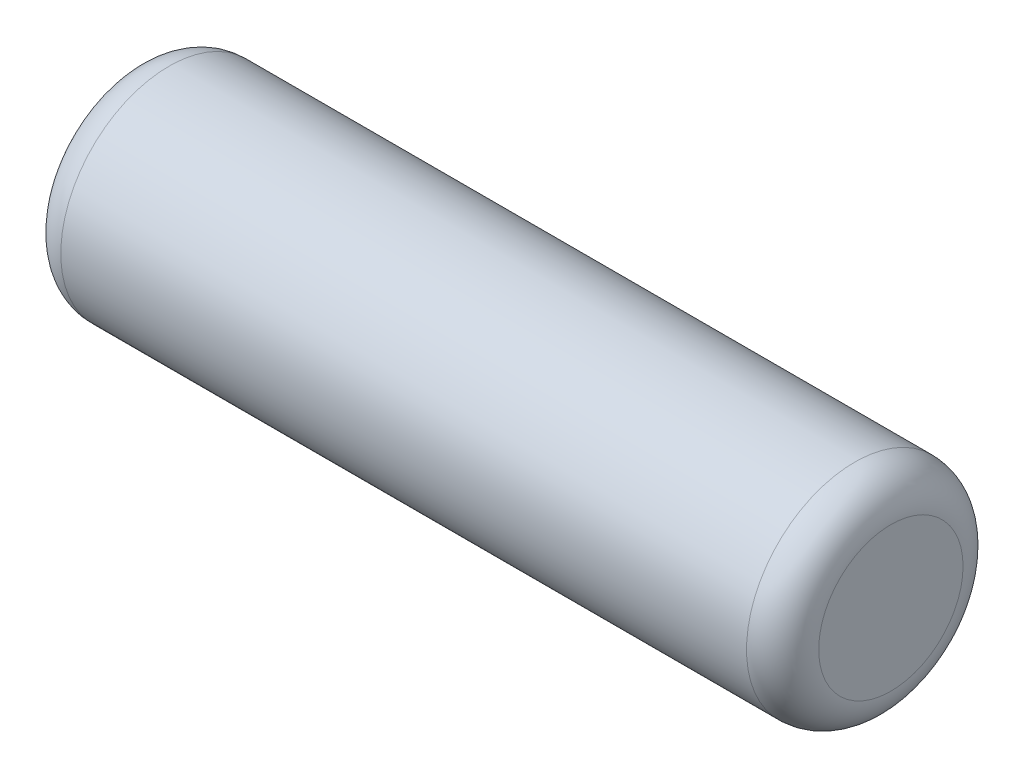
ISO-10303-21;
HEADER;
FILE_DESCRIPTION(('STEP AP214'),'2;1');
FILE_NAME('part.step','',(''),(''),'','','');
FILE_SCHEMA(('AUTOMOTIVE_DESIGN { 1 0 10303 214 1 1 1 1 }'));
ENDSEC;
DATA;
#1=APPLICATION_CONTEXT('core data for automotive mechanical design processes');
#2=APPLICATION_PROTOCOL_DEFINITION('international standard','automotive_design',2000,#1);
#3=PRODUCT_CONTEXT('',#1,'mechanical');
#4=PRODUCT('Part','Part','',(#3));
#5=PRODUCT_RELATED_PRODUCT_CATEGORY('part','',(#4));
#6=PRODUCT_DEFINITION_FORMATION('','',#4);
#7=PRODUCT_DEFINITION_CONTEXT('part definition',#1,'design');
#8=PRODUCT_DEFINITION('design','',#6,#7);
#9=PRODUCT_DEFINITION_SHAPE('','',#8);
#10=(LENGTH_UNIT() NAMED_UNIT(*) SI_UNIT(.MILLI.,.METRE.));
#11=(NAMED_UNIT(*) PLANE_ANGLE_UNIT() SI_UNIT($,.RADIAN.));
#12=(NAMED_UNIT(*) SI_UNIT($,.STERADIAN.) SOLID_ANGLE_UNIT());
#13=UNCERTAINTY_MEASURE_WITH_UNIT(LENGTH_MEASURE(1.E-05),#10,'distance_accuracy_value','');
#14=(GEOMETRIC_REPRESENTATION_CONTEXT(3) GLOBAL_UNCERTAINTY_ASSIGNED_CONTEXT((#13)) GLOBAL_UNIT_ASSIGNED_CONTEXT((#10,
#11,#12)) REPRESENTATION_CONTEXT('',''));
#15=CARTESIAN_POINT('',(0.,0.,0.));
#16=DIRECTION('',(0.,0.,1.));
#17=DIRECTION('',(1.,0.,0.));
#18=AXIS2_PLACEMENT_3D('',#15,#16,#17);
#19=CARTESIAN_POINT('',(26.67,0.,0.));
#20=DIRECTION('',(-1.,0.,0.));
#21=DIRECTION('',(0.,0.,1.));
#22=AXIS2_PLACEMENT_3D('',#19,#20,#21);
#23=CYLINDRICAL_SURFACE('',#22,3.81);
#24=CARTESIAN_POINT('',(1.27,0.,0.));
#25=DIRECTION('',(1.,0.,0.));
#26=DIRECTION('',(0.,0.,-1.));
#27=AXIS2_PLACEMENT_3D('',#24,#25,#26);
#28=CIRCLE('',#27,3.81);
#29=CARTESIAN_POINT('',(1.27,0.,-3.81));
#30=VERTEX_POINT('',#29);
#31=EDGE_CURVE('E42',#30,#30,#28,.T.);
#32=ORIENTED_EDGE('',*,*,#31,.T.);
#33=EDGE_LOOP('',(#32));
#34=FACE_BOUND('',#33,.T.);
#35=CARTESIAN_POINT('',(25.4,0.,0.));
#36=DIRECTION('',(1.,0.,0.));
#37=DIRECTION('',(0.,0.,-1.));
#38=AXIS2_PLACEMENT_3D('',#35,#36,#37);
#39=CIRCLE('',#38,3.81);
#40=CARTESIAN_POINT('',(25.4,0.,-3.81));
#41=VERTEX_POINT('',#40);
#42=EDGE_CURVE('E46',#41,#41,#39,.F.);
#43=ORIENTED_EDGE('',*,*,#42,.T.);
#44=EDGE_LOOP('',(#43));
#45=FACE_BOUND('',#44,.T.);
#46=ADVANCED_FACE('F31',(#34,#45),#23,.T.);
#47=CARTESIAN_POINT('',(26.67,0.,0.));
#48=DIRECTION('',(1.,0.,0.));
#49=DIRECTION('',(0.,0.,-1.));
#50=AXIS2_PLACEMENT_3D('',#47,#48,#49);
#51=PLANE('',#50);
#52=CARTESIAN_POINT('',(26.67,0.,0.));
#53=DIRECTION('',(1.,0.,0.));
#54=DIRECTION('',(0.,0.,-1.));
#55=AXIS2_PLACEMENT_3D('',#52,#53,#54);
#56=CIRCLE('',#55,2.54);
#57=CARTESIAN_POINT('',(26.67,0.,-2.54));
#58=VERTEX_POINT('',#57);
#59=EDGE_CURVE('E10',#58,#58,#56,.T.);
#60=ORIENTED_EDGE('',*,*,#59,.T.);
#61=EDGE_LOOP('',(#60));
#62=FACE_BOUND('',#61,.T.);
#63=ADVANCED_FACE('F62',(#62),#51,.T.);
#64=CARTESIAN_POINT('',(0.,0.,0.));
#65=DIRECTION('',(1.,0.,0.));
#66=DIRECTION('',(0.,0.,-1.));
#67=AXIS2_PLACEMENT_3D('',#64,#65,#66);
#68=PLANE('',#67);
#69=CARTESIAN_POINT('',(0.,0.,0.));
#70=DIRECTION('',(1.,0.,0.));
#71=DIRECTION('',(0.,0.,-1.));
#72=AXIS2_PLACEMENT_3D('',#69,#70,#71);
#73=CIRCLE('',#72,2.54);
#74=CARTESIAN_POINT('',(0.,0.,-2.54));
#75=VERTEX_POINT('',#74);
#76=EDGE_CURVE('E38',#75,#75,#73,.F.);
#77=ORIENTED_EDGE('',*,*,#76,.T.);
#78=EDGE_LOOP('',(#77));
#79=FACE_BOUND('',#78,.T.);
#80=ADVANCED_FACE('F59',(#79),#68,.F.);
#81=CARTESIAN_POINT('',(1.27,0.,0.));
#82=DIRECTION('',(1.,0.,0.));
#83=DIRECTION('',(0.,0.,-1.));
#84=AXIS2_PLACEMENT_3D('',#81,#82,#83);
#85=TOROIDAL_SURFACE('',#84,2.54,1.27);
#86=ORIENTED_EDGE('',*,*,#76,.F.);
#87=EDGE_LOOP('',(#86));
#88=FACE_BOUND('',#87,.T.);
#89=ORIENTED_EDGE('',*,*,#31,.F.);
#90=EDGE_LOOP('',(#89));
#91=FACE_BOUND('',#90,.T.);
#92=ADVANCED_FACE('F55',(#88,#91),#85,.T.);
#93=CARTESIAN_POINT('',(25.4,0.,0.));
#94=DIRECTION('',(1.,0.,0.));
#95=DIRECTION('',(0.,0.,-1.));
#96=AXIS2_PLACEMENT_3D('',#93,#94,#95);
#97=TOROIDAL_SURFACE('',#96,2.54,1.27);
#98=ORIENTED_EDGE('',*,*,#42,.F.);
#99=EDGE_LOOP('',(#98));
#100=FACE_BOUND('',#99,.T.);
#101=ORIENTED_EDGE('',*,*,#59,.F.);
#102=EDGE_LOOP('',(#101));
#103=FACE_BOUND('',#102,.T.);
#104=ADVANCED_FACE('F33',(#100,#103),#97,.T.);
#105=CLOSED_SHELL('',(#46,#63,#80,#92,#104));
#106=MANIFOLD_SOLID_BREP('B2',#105);
#107=ADVANCED_BREP_SHAPE_REPRESENTATION('',(#18,#106),#14);
#108=SHAPE_DEFINITION_REPRESENTATION(#9,#107);
ENDSEC;
END-ISO-10303-21;
